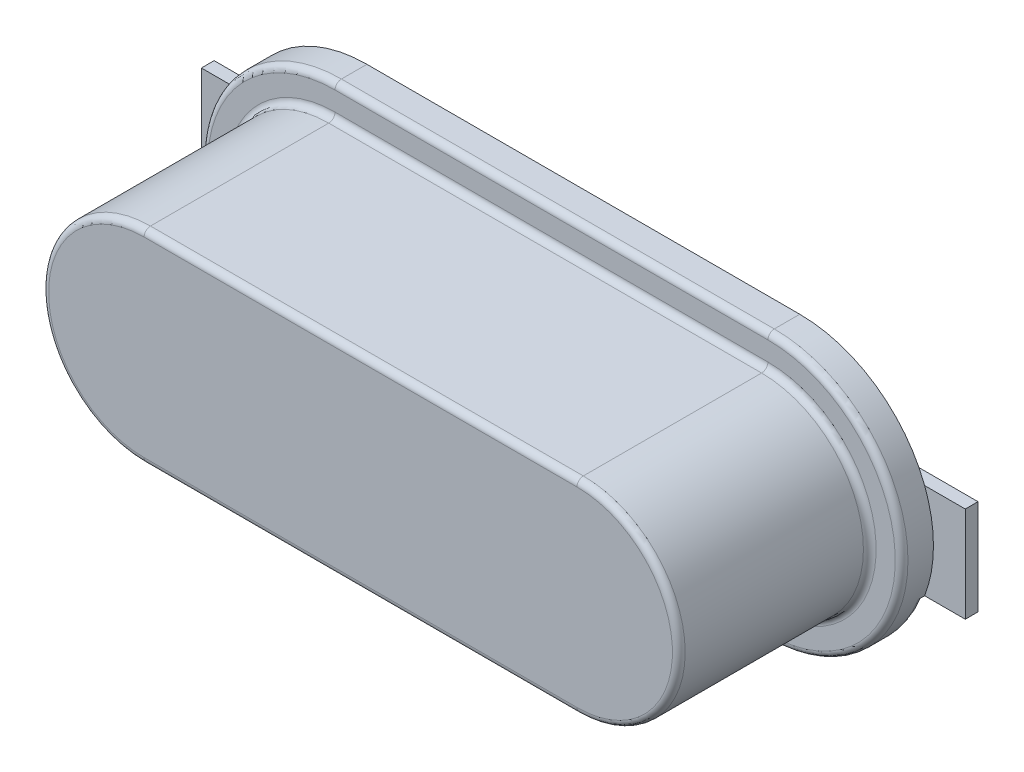
ISO-10303-21;
HEADER;
FILE_DESCRIPTION(('STEP AP214'),'2;1');
FILE_NAME('part.step','',(''),(''),'','','');
FILE_SCHEMA(('AUTOMOTIVE_DESIGN { 1 0 10303 214 1 1 1 1 }'));
ENDSEC;
DATA;
#1=APPLICATION_CONTEXT('core data for automotive mechanical design processes');
#2=APPLICATION_PROTOCOL_DEFINITION('international standard','automotive_design',2000,#1);
#3=PRODUCT_CONTEXT('',#1,'mechanical');
#4=PRODUCT('Part','Part','',(#3));
#5=PRODUCT_RELATED_PRODUCT_CATEGORY('part','',(#4));
#6=PRODUCT_DEFINITION_FORMATION('','',#4);
#7=PRODUCT_DEFINITION_CONTEXT('part definition',#1,'design');
#8=PRODUCT_DEFINITION('design','',#6,#7);
#9=PRODUCT_DEFINITION_SHAPE('','',#8);
#10=(LENGTH_UNIT() NAMED_UNIT(*) SI_UNIT(.MILLI.,.METRE.));
#11=(NAMED_UNIT(*) PLANE_ANGLE_UNIT() SI_UNIT($,.RADIAN.));
#12=(NAMED_UNIT(*) SI_UNIT($,.STERADIAN.) SOLID_ANGLE_UNIT());
#13=UNCERTAINTY_MEASURE_WITH_UNIT(LENGTH_MEASURE(1.E-05),#10,'distance_accuracy_value','');
#14=(GEOMETRIC_REPRESENTATION_CONTEXT(3) GLOBAL_UNCERTAINTY_ASSIGNED_CONTEXT((#13)) GLOBAL_UNIT_ASSIGNED_CONTEXT((#10,
#11,#12)) REPRESENTATION_CONTEXT('',''));
#15=CARTESIAN_POINT('',(0.,0.,0.));
#16=DIRECTION('',(0.,0.,1.));
#17=DIRECTION('',(1.,0.,0.));
#18=AXIS2_PLACEMENT_3D('',#15,#16,#17);
#19=CARTESIAN_POINT('',(3.4,0.,0.));
#20=DIRECTION('',(0.,0.,1.));
#21=DIRECTION('',(1.,0.,0.));
#22=AXIS2_PLACEMENT_3D('',#19,#20,#21);
#23=PLANE('',#22);
#24=DIRECTION('',(1.,0.,0.));
#25=VECTOR('',#24,1.);
#26=CARTESIAN_POINT('',(3.4,-2.,0.));
#27=LINE('',#26,#25);
#28=CARTESIAN_POINT('',(3.4,-2.,0.));
#29=VERTEX_POINT('',#28);
#30=CARTESIAN_POINT('',(-3.4,-2.,0.));
#31=VERTEX_POINT('',#30);
#32=EDGE_CURVE('E318',#29,#31,#27,.F.);
#33=ORIENTED_EDGE('',*,*,#32,.T.);
#34=CARTESIAN_POINT('',(-3.4,0.,0.));
#35=DIRECTION('',(0.,0.,1.));
#36=DIRECTION('',(1.,0.,0.));
#37=AXIS2_PLACEMENT_3D('',#34,#35,#36);
#38=CIRCLE('',#37,2.);
#39=CARTESIAN_POINT('',(-5.25404962177391,-0.75,0.));
#40=VERTEX_POINT('',#39);
#41=EDGE_CURVE('E322',#31,#40,#38,.F.);
#42=ORIENTED_EDGE('',*,*,#41,.T.);
#43=DIRECTION('',(-1.,0.,0.));
#44=VECTOR('',#43,1.);
#45=CARTESIAN_POINT('',(-6.00000000000001,-0.75,0.));
#46=LINE('',#45,#44);
#47=CARTESIAN_POINT('',(-2.5,-0.75,0.));
#48=VERTEX_POINT('',#47);
#49=EDGE_CURVE('E263',#48,#40,#46,.T.);
#50=ORIENTED_EDGE('',*,*,#49,.F.);
#51=DIRECTION('',(0.,-1.,0.));
#52=VECTOR('',#51,1.);
#53=CARTESIAN_POINT('',(-2.49999999999999,0.75,0.));
#54=LINE('',#53,#52);
#55=CARTESIAN_POINT('',(-2.49999999999999,0.75,0.));
#56=VERTEX_POINT('',#55);
#57=EDGE_CURVE('E242',#56,#48,#54,.T.);
#58=ORIENTED_EDGE('',*,*,#57,.F.);
#59=DIRECTION('',(1.,0.,0.));
#60=VECTOR('',#59,1.);
#61=CARTESIAN_POINT('',(-5.99999999999999,0.75,0.));
#62=LINE('',#61,#60);
#63=CARTESIAN_POINT('',(-5.3615045245933,0.75,0.));
#64=VERTEX_POINT('',#63);
#65=EDGE_CURVE('E244',#64,#56,#62,.T.);
#66=ORIENTED_EDGE('',*,*,#65,.F.);
#67=CARTESIAN_POINT('',(-3.4,0.,0.));
#68=DIRECTION('',(0.,0.,1.));
#69=DIRECTION('',(-1.,0.,0.));
#70=AXIS2_PLACEMENT_3D('',#67,#68,#69);
#71=CIRCLE('',#70,2.1);
#72=CARTESIAN_POINT('',(-3.4,2.1,0.));
#73=VERTEX_POINT('',#72);
#74=EDGE_CURVE('E298',#73,#64,#71,.T.);
#75=ORIENTED_EDGE('',*,*,#74,.F.);
#76=DIRECTION('',(-1.,0.,0.));
#77=VECTOR('',#76,1.);
#78=CARTESIAN_POINT('',(3.4,2.1,0.));
#79=LINE('',#78,#77);
#80=CARTESIAN_POINT('',(3.4,2.1,0.));
#81=VERTEX_POINT('',#80);
#82=EDGE_CURVE('E294',#81,#73,#79,.T.);
#83=ORIENTED_EDGE('',*,*,#82,.F.);
#84=CARTESIAN_POINT('',(3.4,0.,0.));
#85=DIRECTION('',(0.,0.,1.));
#86=DIRECTION('',(1.,0.,0.));
#87=AXIS2_PLACEMENT_3D('',#84,#85,#86);
#88=CIRCLE('',#87,2.1);
#89=CARTESIAN_POINT('',(5.3615045245933,0.75,0.));
#90=VERTEX_POINT('',#89);
#91=EDGE_CURVE('E290',#90,#81,#88,.T.);
#92=ORIENTED_EDGE('',*,*,#91,.F.);
#93=DIRECTION('',(1.,0.,0.));
#94=VECTOR('',#93,1.);
#95=CARTESIAN_POINT('',(6.,0.75,0.));
#96=LINE('',#95,#94);
#97=CARTESIAN_POINT('',(2.5,0.75,0.));
#98=VERTEX_POINT('',#97);
#99=EDGE_CURVE('E839',#98,#90,#96,.T.);
#100=ORIENTED_EDGE('',*,*,#99,.F.);
#101=DIRECTION('',(0.,1.,0.));
#102=VECTOR('',#101,1.);
#103=CARTESIAN_POINT('',(2.5,0.75,0.));
#104=LINE('',#103,#102);
#105=CARTESIAN_POINT('',(2.5,-0.75,0.));
#106=VERTEX_POINT('',#105);
#107=EDGE_CURVE('E233',#106,#98,#104,.T.);
#108=ORIENTED_EDGE('',*,*,#107,.F.);
#109=DIRECTION('',(-1.,0.,0.));
#110=VECTOR('',#109,1.);
#111=CARTESIAN_POINT('',(6.,-0.75,0.));
#112=LINE('',#111,#110);
#113=CARTESIAN_POINT('',(5.25404962177391,-0.75,0.));
#114=VERTEX_POINT('',#113);
#115=EDGE_CURVE('E844',#114,#106,#112,.T.);
#116=ORIENTED_EDGE('',*,*,#115,.F.);
#117=CARTESIAN_POINT('',(3.4,0.,0.));
#118=DIRECTION('',(0.,0.,1.));
#119=DIRECTION('',(1.,0.,0.));
#120=AXIS2_PLACEMENT_3D('',#117,#118,#119);
#121=CIRCLE('',#120,2.);
#122=EDGE_CURVE('E320',#114,#29,#121,.F.);
#123=ORIENTED_EDGE('',*,*,#122,.T.);
#124=EDGE_LOOP('',(#33,#42,#50,#58,#66,#75,#83,#92,#100,#108,#116,#123));
#125=FACE_BOUND('',#124,.T.);
#126=ADVANCED_FACE('F33',(#125),#23,.F.);
#127=CARTESIAN_POINT('',(3.4,0.,0.5));
#128=DIRECTION('',(0.,0.,1.));
#129=DIRECTION('',(1.,0.,0.));
#130=AXIS2_PLACEMENT_3D('',#127,#128,#129);
#131=PLANE('',#130);
#132=DIRECTION('',(-1.,0.,0.));
#133=VECTOR('',#132,1.);
#134=CARTESIAN_POINT('',(-3.4,2.,0.5));
#135=LINE('',#134,#133);
#136=CARTESIAN_POINT('',(3.4,2.,0.5));
#137=VERTEX_POINT('',#136);
#138=CARTESIAN_POINT('',(-3.4,2.,0.5));
#139=VERTEX_POINT('',#138);
#140=EDGE_CURVE('E344',#137,#139,#135,.T.);
#141=ORIENTED_EDGE('',*,*,#140,.T.);
#142=CARTESIAN_POINT('',(-3.4,0.,0.5));
#143=DIRECTION('',(0.,0.,1.));
#144=DIRECTION('',(1.,0.,0.));
#145=AXIS2_PLACEMENT_3D('',#142,#143,#144);
#146=CIRCLE('',#145,2.);
#147=CARTESIAN_POINT('',(-3.4,-2.,0.5));
#148=VERTEX_POINT('',#147);
#149=EDGE_CURVE('E346',#139,#148,#146,.T.);
#150=ORIENTED_EDGE('',*,*,#149,.T.);
#151=DIRECTION('',(1.,0.,0.));
#152=VECTOR('',#151,1.);
#153=CARTESIAN_POINT('',(3.4,-2.,0.5));
#154=LINE('',#153,#152);
#155=CARTESIAN_POINT('',(3.4,-2.,0.5));
#156=VERTEX_POINT('',#155);
#157=EDGE_CURVE('E340',#148,#156,#154,.T.);
#158=ORIENTED_EDGE('',*,*,#157,.T.);
#159=CARTESIAN_POINT('',(3.4,0.,0.5));
#160=DIRECTION('',(0.,0.,1.));
#161=DIRECTION('',(1.,0.,0.));
#162=AXIS2_PLACEMENT_3D('',#159,#160,#161);
#163=CIRCLE('',#162,2.);
#164=EDGE_CURVE('E342',#156,#137,#163,.T.);
#165=ORIENTED_EDGE('',*,*,#164,.T.);
#166=EDGE_LOOP('',(#141,#150,#158,#165));
#167=FACE_BOUND('',#166,.T.);
#168=DIRECTION('',(1.,0.,0.));
#169=VECTOR('',#168,1.);
#170=CARTESIAN_POINT('',(3.4,-1.7,0.5));
#171=LINE('',#170,#169);
#172=CARTESIAN_POINT('',(3.4,-1.7,0.5));
#173=VERTEX_POINT('',#172);
#174=CARTESIAN_POINT('',(-3.39999999999999,-1.7,0.5));
#175=VERTEX_POINT('',#174);
#176=EDGE_CURVE('E331',#173,#175,#171,.F.);
#177=ORIENTED_EDGE('',*,*,#176,.T.);
#178=CARTESIAN_POINT('',(-3.4,0.,0.5));
#179=DIRECTION('',(0.,0.,1.));
#180=DIRECTION('',(1.,0.,0.));
#181=AXIS2_PLACEMENT_3D('',#178,#179,#180);
#182=CIRCLE('',#181,1.7);
#183=CARTESIAN_POINT('',(-3.40000000000001,1.7,0.5));
#184=VERTEX_POINT('',#183);
#185=EDGE_CURVE('E337',#175,#184,#182,.F.);
#186=ORIENTED_EDGE('',*,*,#185,.T.);
#187=DIRECTION('',(-1.,0.,0.));
#188=VECTOR('',#187,1.);
#189=CARTESIAN_POINT('',(3.4,1.7,0.5));
#190=LINE('',#189,#188);
#191=CARTESIAN_POINT('',(3.4,1.7,0.5));
#192=VERTEX_POINT('',#191);
#193=EDGE_CURVE('E335',#184,#192,#190,.F.);
#194=ORIENTED_EDGE('',*,*,#193,.T.);
#195=CARTESIAN_POINT('',(3.4,0.,0.5));
#196=DIRECTION('',(0.,0.,1.));
#197=DIRECTION('',(1.,0.,0.));
#198=AXIS2_PLACEMENT_3D('',#195,#196,#197);
#199=CIRCLE('',#198,1.7);
#200=EDGE_CURVE('E333',#192,#173,#199,.F.);
#201=ORIENTED_EDGE('',*,*,#200,.T.);
#202=EDGE_LOOP('',(#177,#186,#194,#201));
#203=FACE_BOUND('',#202,.T.);
#204=ADVANCED_FACE('F459',(#167,#203),#131,.T.);
#205=CARTESIAN_POINT('',(3.4,0.,0.5));
#206=DIRECTION('',(0.,0.,-1.));
#207=DIRECTION('',(-1.,0.,0.));
#208=AXIS2_PLACEMENT_3D('',#205,#206,#207);
#209=CYLINDRICAL_SURFACE('',#208,2.1);
#210=DIRECTION('',(0.,0.,-1.));
#211=VECTOR('',#210,1.);
#212=CARTESIAN_POINT('',(3.4,-2.1,0.5));
#213=LINE('',#212,#211);
#214=CARTESIAN_POINT('',(3.4,-2.1,0.4));
#215=VERTEX_POINT('',#214);
#216=CARTESIAN_POINT('',(3.4,-2.1,0.1));
#217=VERTEX_POINT('',#216);
#218=EDGE_CURVE('E301',#215,#217,#213,.T.);
#219=ORIENTED_EDGE('',*,*,#218,.T.);
#220=CARTESIAN_POINT('',(3.4,0.,0.1));
#221=DIRECTION('',(0.,0.,1.));
#222=DIRECTION('',(1.,0.,0.));
#223=AXIS2_PLACEMENT_3D('',#220,#221,#222);
#224=CIRCLE('',#223,2.1);
#225=CARTESIAN_POINT('',(5.3615045245933,-0.75,0.1));
#226=VERTEX_POINT('',#225);
#227=EDGE_CURVE('E328',#217,#226,#224,.T.);
#228=ORIENTED_EDGE('',*,*,#227,.T.);
#229=DIRECTION('',(0.,0.,-1.));
#230=VECTOR('',#229,1.);
#231=CARTESIAN_POINT('',(5.3615045245933,-0.75,0.1));
#232=LINE('',#231,#230);
#233=CARTESIAN_POINT('',(5.3615045245933,-0.75,0.));
#234=VERTEX_POINT('',#233);
#235=EDGE_CURVE('E326',#226,#234,#232,.T.);
#236=ORIENTED_EDGE('',*,*,#235,.T.);
#237=EDGE_CURVE('E293',#234,#90,#88,.T.);
#238=ORIENTED_EDGE('',*,*,#237,.T.);
#239=ORIENTED_EDGE('',*,*,#91,.T.);
#240=DIRECTION('',(0.,0.,-1.));
#241=VECTOR('',#240,1.);
#242=CARTESIAN_POINT('',(3.4,2.1,0.5));
#243=LINE('',#242,#241);
#244=CARTESIAN_POINT('',(3.4,2.1,0.4));
#245=VERTEX_POINT('',#244);
#246=EDGE_CURVE('E309',#245,#81,#243,.T.);
#247=ORIENTED_EDGE('',*,*,#246,.F.);
#248=CARTESIAN_POINT('',(3.4,0.,0.4));
#249=DIRECTION('',(0.,0.,1.));
#250=DIRECTION('',(1.,0.,0.));
#251=AXIS2_PLACEMENT_3D('',#248,#249,#250);
#252=CIRCLE('',#251,2.1);
#253=EDGE_CURVE('E324',#245,#215,#252,.F.);
#254=ORIENTED_EDGE('',*,*,#253,.T.);
#255=EDGE_LOOP('',(#219,#228,#236,#238,#239,#247,#254));
#256=FACE_BOUND('',#255,.T.);
#257=ADVANCED_FACE('F403',(#256),#209,.T.);
#258=CARTESIAN_POINT('',(3.4,2.1,0.5));
#259=DIRECTION('',(0.,-1.,0.));
#260=DIRECTION('',(0.,0.,-1.));
#261=AXIS2_PLACEMENT_3D('',#258,#259,#260);
#262=PLANE('',#261);
#263=DIRECTION('',(0.,0.,-1.));
#264=VECTOR('',#263,1.);
#265=CARTESIAN_POINT('',(-3.4,2.1,0.5));
#266=LINE('',#265,#264);
#267=CARTESIAN_POINT('',(-3.4,2.1,0.4));
#268=VERTEX_POINT('',#267);
#269=EDGE_CURVE('E307',#268,#73,#266,.T.);
#270=ORIENTED_EDGE('',*,*,#269,.F.);
#271=DIRECTION('',(-1.,0.,0.));
#272=VECTOR('',#271,1.);
#273=CARTESIAN_POINT('',(3.4,2.1,0.4));
#274=LINE('',#273,#272);
#275=EDGE_CURVE('E349',#268,#245,#274,.F.);
#276=ORIENTED_EDGE('',*,*,#275,.T.);
#277=ORIENTED_EDGE('',*,*,#246,.T.);
#278=ORIENTED_EDGE('',*,*,#82,.T.);
#279=EDGE_LOOP('',(#270,#276,#277,#278));
#280=FACE_BOUND('',#279,.T.);
#281=ADVANCED_FACE('F476',(#280),#262,.F.);
#282=CARTESIAN_POINT('',(-3.4,0.,0.5));
#283=DIRECTION('',(0.,0.,-1.));
#284=DIRECTION('',(-1.,0.,0.));
#285=AXIS2_PLACEMENT_3D('',#282,#283,#284);
#286=CYLINDRICAL_SURFACE('',#285,2.1);
#287=DIRECTION('',(0.,0.,-1.));
#288=VECTOR('',#287,1.);
#289=CARTESIAN_POINT('',(-5.3615045245933,-0.75,0.));
#290=LINE('',#289,#288);
#291=CARTESIAN_POINT('',(-5.3615045245933,-0.75,0.));
#292=VERTEX_POINT('',#291);
#293=CARTESIAN_POINT('',(-5.3615045245933,-0.75,0.1));
#294=VERTEX_POINT('',#293);
#295=EDGE_CURVE('E50',#292,#294,#290,.F.);
#296=ORIENTED_EDGE('',*,*,#295,.T.);
#297=CARTESIAN_POINT('',(-3.4,0.,0.1));
#298=DIRECTION('',(0.,0.,1.));
#299=DIRECTION('',(1.,0.,0.));
#300=AXIS2_PLACEMENT_3D('',#297,#298,#299);
#301=CIRCLE('',#300,2.1);
#302=CARTESIAN_POINT('',(-3.4,-2.1,0.1));
#303=VERTEX_POINT('',#302);
#304=EDGE_CURVE('E315',#294,#303,#301,.T.);
#305=ORIENTED_EDGE('',*,*,#304,.T.);
#306=DIRECTION('',(0.,0.,-1.));
#307=VECTOR('',#306,1.);
#308=CARTESIAN_POINT('',(-3.4,-2.1,0.5));
#309=LINE('',#308,#307);
#310=CARTESIAN_POINT('',(-3.4,-2.1,0.4));
#311=VERTEX_POINT('',#310);
#312=EDGE_CURVE('E304',#311,#303,#309,.T.);
#313=ORIENTED_EDGE('',*,*,#312,.F.);
#314=CARTESIAN_POINT('',(-3.4,0.,0.4));
#315=DIRECTION('',(0.,0.,1.));
#316=DIRECTION('',(1.,0.,0.));
#317=AXIS2_PLACEMENT_3D('',#314,#315,#316);
#318=CIRCLE('',#317,2.1);
#319=EDGE_CURVE('E311',#311,#268,#318,.F.);
#320=ORIENTED_EDGE('',*,*,#319,.T.);
#321=ORIENTED_EDGE('',*,*,#269,.T.);
#322=ORIENTED_EDGE('',*,*,#74,.T.);
#323=EDGE_CURVE('E297',#64,#292,#71,.T.);
#324=ORIENTED_EDGE('',*,*,#323,.T.);
#325=EDGE_LOOP('',(#296,#305,#313,#320,#321,#322,#324));
#326=FACE_BOUND('',#325,.T.);
#327=ADVANCED_FACE('F473',(#326),#286,.T.);
#328=CARTESIAN_POINT('',(3.4,-2.1,0.5));
#329=DIRECTION('',(0.,1.,0.));
#330=DIRECTION('',(0.,0.,1.));
#331=AXIS2_PLACEMENT_3D('',#328,#329,#330);
#332=PLANE('',#331);
#333=ORIENTED_EDGE('',*,*,#312,.T.);
#334=DIRECTION('',(1.,0.,0.));
#335=VECTOR('',#334,1.);
#336=CARTESIAN_POINT('',(3.4,-2.1,0.1));
#337=LINE('',#336,#335);
#338=EDGE_CURVE('E374',#303,#217,#337,.T.);
#339=ORIENTED_EDGE('',*,*,#338,.T.);
#340=ORIENTED_EDGE('',*,*,#218,.F.);
#341=DIRECTION('',(1.,0.,0.));
#342=VECTOR('',#341,1.);
#343=CARTESIAN_POINT('',(-3.4,-2.1,0.4));
#344=LINE('',#343,#342);
#345=EDGE_CURVE('E372',#215,#311,#344,.F.);
#346=ORIENTED_EDGE('',*,*,#345,.T.);
#347=EDGE_LOOP('',(#333,#339,#340,#346));
#348=FACE_BOUND('',#347,.T.);
#349=ADVANCED_FACE('F469',(#348),#332,.F.);
#350=CARTESIAN_POINT('',(3.4,0.,3.5));
#351=DIRECTION('',(0.,0.,-1.));
#352=DIRECTION('',(-1.,0.,0.));
#353=AXIS2_PLACEMENT_3D('',#350,#351,#352);
#354=CYLINDRICAL_SURFACE('',#353,1.6);
#355=DIRECTION('',(0.,0.,-1.));
#356=VECTOR('',#355,1.);
#357=CARTESIAN_POINT('',(3.4,-1.6,3.5));
#358=LINE('',#357,#356);
#359=CARTESIAN_POINT('',(3.4,-1.6,3.4));
#360=VERTEX_POINT('',#359);
#361=CARTESIAN_POINT('',(3.4,-1.6,0.6));
#362=VERTEX_POINT('',#361);
#363=EDGE_CURVE('E278',#360,#362,#358,.T.);
#364=ORIENTED_EDGE('',*,*,#363,.T.);
#365=CARTESIAN_POINT('',(3.4,0.,0.6));
#366=DIRECTION('',(0.,0.,1.));
#367=DIRECTION('',(1.,0.,0.));
#368=AXIS2_PLACEMENT_3D('',#365,#366,#367);
#369=CIRCLE('',#368,1.6);
#370=CARTESIAN_POINT('',(3.4,1.6,0.6));
#371=VERTEX_POINT('',#370);
#372=EDGE_CURVE('E363',#362,#371,#369,.T.);
#373=ORIENTED_EDGE('',*,*,#372,.T.);
#374=DIRECTION('',(0.,0.,-1.));
#375=VECTOR('',#374,1.);
#376=CARTESIAN_POINT('',(3.4,1.6,3.5));
#377=LINE('',#376,#375);
#378=CARTESIAN_POINT('',(3.4,1.6,3.4));
#379=VERTEX_POINT('',#378);
#380=EDGE_CURVE('E287',#379,#371,#377,.T.);
#381=ORIENTED_EDGE('',*,*,#380,.F.);
#382=CARTESIAN_POINT('',(3.4,0.,3.4));
#383=DIRECTION('',(0.,0.,1.));
#384=DIRECTION('',(1.,0.,0.));
#385=AXIS2_PLACEMENT_3D('',#382,#383,#384);
#386=CIRCLE('',#385,1.6);
#387=EDGE_CURVE('E361',#379,#360,#386,.F.);
#388=ORIENTED_EDGE('',*,*,#387,.T.);
#389=EDGE_LOOP('',(#364,#373,#381,#388));
#390=FACE_BOUND('',#389,.T.);
#391=ADVANCED_FACE('F472',(#390),#354,.T.);
#392=CARTESIAN_POINT('',(-3.40000000000001,1.6,3.5));
#393=DIRECTION('',(0.,-1.,0.));
#394=DIRECTION('',(0.,0.,-1.));
#395=AXIS2_PLACEMENT_3D('',#392,#393,#394);
#396=PLANE('',#395);
#397=ORIENTED_EDGE('',*,*,#380,.T.);
#398=DIRECTION('',(-1.,0.,0.));
#399=VECTOR('',#398,1.);
#400=CARTESIAN_POINT('',(-3.40000000000001,1.6,0.6));
#401=LINE('',#400,#399);
#402=CARTESIAN_POINT('',(-3.40000000000001,1.6,0.6));
#403=VERTEX_POINT('',#402);
#404=EDGE_CURVE('E359',#371,#403,#401,.T.);
#405=ORIENTED_EDGE('',*,*,#404,.T.);
#406=DIRECTION('',(0.,0.,-1.));
#407=VECTOR('',#406,1.);
#408=CARTESIAN_POINT('',(-3.40000000000001,1.6,3.5));
#409=LINE('',#408,#407);
#410=CARTESIAN_POINT('',(-3.40000000000001,1.6,3.4));
#411=VERTEX_POINT('',#410);
#412=EDGE_CURVE('E284',#411,#403,#409,.T.);
#413=ORIENTED_EDGE('',*,*,#412,.F.);
#414=DIRECTION('',(-1.,0.,0.));
#415=VECTOR('',#414,1.);
#416=CARTESIAN_POINT('',(3.4,1.6,3.4));
#417=LINE('',#416,#415);
#418=EDGE_CURVE('E356',#411,#379,#417,.F.);
#419=ORIENTED_EDGE('',*,*,#418,.T.);
#420=EDGE_LOOP('',(#397,#405,#413,#419));
#421=FACE_BOUND('',#420,.T.);
#422=ADVANCED_FACE('F555',(#421),#396,.F.);
#423=CARTESIAN_POINT('',(-3.4,0.,3.5));
#424=DIRECTION('',(0.,0.,-1.));
#425=DIRECTION('',(-1.,0.,0.));
#426=AXIS2_PLACEMENT_3D('',#423,#424,#425);
#427=CYLINDRICAL_SURFACE('',#426,1.6);
#428=ORIENTED_EDGE('',*,*,#412,.T.);
#429=CARTESIAN_POINT('',(-3.4,0.,0.6));
#430=DIRECTION('',(0.,0.,1.));
#431=DIRECTION('',(1.,0.,0.));
#432=AXIS2_PLACEMENT_3D('',#429,#430,#431);
#433=CIRCLE('',#432,1.6);
#434=CARTESIAN_POINT('',(-3.39999999999999,-1.6,0.6));
#435=VERTEX_POINT('',#434);
#436=EDGE_CURVE('E353',#403,#435,#433,.T.);
#437=ORIENTED_EDGE('',*,*,#436,.T.);
#438=DIRECTION('',(0.,0.,-1.));
#439=VECTOR('',#438,1.);
#440=CARTESIAN_POINT('',(-3.39999999999999,-1.6,3.5));
#441=LINE('',#440,#439);
#442=CARTESIAN_POINT('',(-3.39999999999999,-1.6,3.4));
#443=VERTEX_POINT('',#442);
#444=EDGE_CURVE('E281',#443,#435,#441,.T.);
#445=ORIENTED_EDGE('',*,*,#444,.F.);
#446=CARTESIAN_POINT('',(-3.4,0.,3.4));
#447=DIRECTION('',(0.,0.,1.));
#448=DIRECTION('',(1.,0.,0.));
#449=AXIS2_PLACEMENT_3D('',#446,#447,#448);
#450=CIRCLE('',#449,1.6);
#451=EDGE_CURVE('E351',#443,#411,#450,.F.);
#452=ORIENTED_EDGE('',*,*,#451,.T.);
#453=EDGE_LOOP('',(#428,#437,#445,#452));
#454=FACE_BOUND('',#453,.T.);
#455=ADVANCED_FACE('F538',(#454),#427,.T.);
#456=CARTESIAN_POINT('',(-3.39999999999999,-1.6,3.5));
#457=DIRECTION('',(0.,1.,0.));
#458=DIRECTION('',(0.,0.,1.));
#459=AXIS2_PLACEMENT_3D('',#456,#457,#458);
#460=PLANE('',#459);
#461=ORIENTED_EDGE('',*,*,#444,.T.);
#462=DIRECTION('',(1.,0.,0.));
#463=VECTOR('',#462,1.);
#464=CARTESIAN_POINT('',(-3.39999999999999,-1.6,0.6));
#465=LINE('',#464,#463);
#466=EDGE_CURVE('E378',#435,#362,#465,.T.);
#467=ORIENTED_EDGE('',*,*,#466,.T.);
#468=ORIENTED_EDGE('',*,*,#363,.F.);
#469=DIRECTION('',(1.,0.,0.));
#470=VECTOR('',#469,1.);
#471=CARTESIAN_POINT('',(-3.39999999999999,-1.6,3.4));
#472=LINE('',#471,#470);
#473=EDGE_CURVE('E376',#360,#443,#472,.F.);
#474=ORIENTED_EDGE('',*,*,#473,.T.);
#475=EDGE_LOOP('',(#461,#467,#468,#474));
#476=FACE_BOUND('',#475,.T.);
#477=ADVANCED_FACE('F536',(#476),#460,.F.);
#478=CARTESIAN_POINT('',(3.4,0.,3.5));
#479=DIRECTION('',(0.,0.,1.));
#480=DIRECTION('',(1.,0.,0.));
#481=AXIS2_PLACEMENT_3D('',#478,#479,#480);
#482=PLANE('',#481);
#483=CARTESIAN_POINT('',(3.4,0.,3.5));
#484=DIRECTION('',(0.,0.,1.));
#485=DIRECTION('',(1.,0.,0.));
#486=AXIS2_PLACEMENT_3D('',#483,#484,#485);
#487=CIRCLE('',#486,1.5);
#488=CARTESIAN_POINT('',(3.4,-1.5,3.5));
#489=VERTEX_POINT('',#488);
#490=CARTESIAN_POINT('',(3.4,1.5,3.5));
#491=VERTEX_POINT('',#490);
#492=EDGE_CURVE('E58',#489,#491,#487,.T.);
#493=ORIENTED_EDGE('',*,*,#492,.T.);
#494=DIRECTION('',(-1.,0.,0.));
#495=VECTOR('',#494,1.);
#496=CARTESIAN_POINT('',(-3.40000000000001,1.5,3.5));
#497=LINE('',#496,#495);
#498=CARTESIAN_POINT('',(-3.40000000000001,1.5,3.5));
#499=VERTEX_POINT('',#498);
#500=EDGE_CURVE('E370',#491,#499,#497,.T.);
#501=ORIENTED_EDGE('',*,*,#500,.T.);
#502=CARTESIAN_POINT('',(-3.4,0.,3.5));
#503=DIRECTION('',(0.,0.,1.));
#504=DIRECTION('',(1.,0.,0.));
#505=AXIS2_PLACEMENT_3D('',#502,#503,#504);
#506=CIRCLE('',#505,1.5);
#507=CARTESIAN_POINT('',(-3.39999999999999,-1.5,3.5));
#508=VERTEX_POINT('',#507);
#509=EDGE_CURVE('E367',#499,#508,#506,.T.);
#510=ORIENTED_EDGE('',*,*,#509,.T.);
#511=DIRECTION('',(1.,0.,0.));
#512=VECTOR('',#511,1.);
#513=CARTESIAN_POINT('',(3.4,-1.5,3.5));
#514=LINE('',#513,#512);
#515=EDGE_CURVE('E365',#508,#489,#514,.T.);
#516=ORIENTED_EDGE('',*,*,#515,.T.);
#517=EDGE_LOOP('',(#493,#501,#510,#516));
#518=FACE_BOUND('',#517,.T.);
#519=ADVANCED_FACE('F559',(#518),#482,.T.);
#520=CARTESIAN_POINT('',(-5.99999999999999,0.75,-0.2));
#521=DIRECTION('',(0.,-1.,0.));
#522=DIRECTION('',(0.,0.,-1.));
#523=AXIS2_PLACEMENT_3D('',#520,#521,#522);
#524=PLANE('',#523);
#525=CARTESIAN_POINT('',(-5.99999999999999,0.75,0.));
#526=VERTEX_POINT('',#525);
#527=EDGE_CURVE('E239',#526,#64,#62,.T.);
#528=ORIENTED_EDGE('',*,*,#527,.T.);
#529=ORIENTED_EDGE('',*,*,#65,.T.);
#530=DIRECTION('',(0.,0.,1.));
#531=VECTOR('',#530,1.);
#532=CARTESIAN_POINT('',(-2.49999999999999,0.75,-0.2));
#533=LINE('',#532,#531);
#534=CARTESIAN_POINT('',(-2.49999999999999,0.75,-0.2));
#535=VERTEX_POINT('',#534);
#536=EDGE_CURVE('E275',#535,#56,#533,.T.);
#537=ORIENTED_EDGE('',*,*,#536,.F.);
#538=DIRECTION('',(1.,0.,0.));
#539=VECTOR('',#538,1.);
#540=CARTESIAN_POINT('',(-5.99999999999999,0.75,-0.2));
#541=LINE('',#540,#539);
#542=CARTESIAN_POINT('',(-5.99999999999999,0.75,-0.2));
#543=VERTEX_POINT('',#542);
#544=EDGE_CURVE('E249',#543,#535,#541,.T.);
#545=ORIENTED_EDGE('',*,*,#544,.F.);
#546=DIRECTION('',(0.,0.,1.));
#547=VECTOR('',#546,1.);
#548=CARTESIAN_POINT('',(-5.99999999999999,0.75,-0.2));
#549=LINE('',#548,#547);
#550=EDGE_CURVE('E258',#543,#526,#549,.T.);
#551=ORIENTED_EDGE('',*,*,#550,.T.);
#552=EDGE_LOOP('',(#528,#529,#537,#545,#551));
#553=FACE_BOUND('',#552,.T.);
#554=ADVANCED_FACE('F561',(#553),#524,.F.);
#555=CARTESIAN_POINT('',(-2.49999999999999,0.75,-0.2));
#556=DIRECTION('',(-1.,0.,0.));
#557=DIRECTION('',(0.,-1.,0.));
#558=AXIS2_PLACEMENT_3D('',#555,#556,#557);
#559=PLANE('',#558);
#560=ORIENTED_EDGE('',*,*,#57,.T.);
#561=DIRECTION('',(0.,0.,1.));
#562=VECTOR('',#561,1.);
#563=CARTESIAN_POINT('',(-2.5,-0.75,-0.2));
#564=LINE('',#563,#562);
#565=CARTESIAN_POINT('',(-2.5,-0.75,-0.2));
#566=VERTEX_POINT('',#565);
#567=EDGE_CURVE('E272',#566,#48,#564,.T.);
#568=ORIENTED_EDGE('',*,*,#567,.F.);
#569=DIRECTION('',(0.,-1.,0.));
#570=VECTOR('',#569,1.);
#571=CARTESIAN_POINT('',(-2.49999999999999,0.75,-0.2));
#572=LINE('',#571,#570);
#573=EDGE_CURVE('E252',#535,#566,#572,.T.);
#574=ORIENTED_EDGE('',*,*,#573,.F.);
#575=ORIENTED_EDGE('',*,*,#536,.T.);
#576=EDGE_LOOP('',(#560,#568,#574,#575));
#577=FACE_BOUND('',#576,.T.);
#578=ADVANCED_FACE('F567',(#577),#559,.F.);
#579=CARTESIAN_POINT('',(-6.00000000000001,-0.75,-0.2));
#580=DIRECTION('',(0.,1.,0.));
#581=DIRECTION('',(-1.,0.,0.));
#582=AXIS2_PLACEMENT_3D('',#579,#580,#581);
#583=PLANE('',#582);
#584=ORIENTED_EDGE('',*,*,#49,.T.);
#585=CARTESIAN_POINT('',(-5.25404962177391,-0.75,0.));
#586=CARTESIAN_POINT('',(-5.26045161334954,-0.75,-3.27733784088097E-06));
#587=CARTESIAN_POINT('',(-5.26685570524247,-0.75,0.000528249062431169));
#588=CARTESIAN_POINT('',(-5.27949864330804,-0.75,0.00264559579485983));
#589=CARTESIAN_POINT('',(-5.28573717218737,-0.75,0.00423330711296517));
#590=CARTESIAN_POINT('',(-5.29786393809105,-0.75,0.00845062253609257));
#591=CARTESIAN_POINT('',(-5.3037516600803,-0.75,0.0110817171347846));
#592=CARTESIAN_POINT('',(-5.31497004181967,-0.75,0.0173359783676304));
#593=CARTESIAN_POINT('',(-5.32030122458989,-0.75,0.0209582017576487));
#594=CARTESIAN_POINT('',(-5.33000322319749,-0.75,0.0289396120595413));
#595=CARTESIAN_POINT('',(-5.33440537338958,-0.75,0.033260628819546));
#596=CARTESIAN_POINT('',(-5.34235593053991,-0.75,0.0426315736421745));
#597=CARTESIAN_POINT('',(-5.34590436296105,-0.75,0.0476814799578188));
#598=CARTESIAN_POINT('',(-5.3517782795725,-0.75,0.0579810578492944));
#599=CARTESIAN_POINT('',(-5.35417210942355,-0.75,0.063191842939927));
#600=CARTESIAN_POINT('',(-5.35798633008743,-0.75,0.0739543167991529));
#601=CARTESIAN_POINT('',(-5.35940832812174,-0.75,0.0795054260845064));
#602=CARTESIAN_POINT('',(-5.36071074513873,-0.75,0.0875920159199155));
#603=CARTESIAN_POINT('',(-5.36100835082311,-0.75,0.0900661463678952));
#604=CARTESIAN_POINT('',(-5.36140505713029,-0.75,0.0950264127283379));
#605=CARTESIAN_POINT('',(-5.36150446448553,-0.75,0.0975125241116698));
#606=CARTESIAN_POINT('',(-5.36150452459331,-0.75,0.0999999999999984));
#607=B_SPLINE_CURVE_WITH_KNOTS('',3,(#585,#586,#587,#588,#589,#590,#591,#592,#593,#594,#595,
#596,#597,#598,#599,#600,#601,#602,#603,#604,#605,#606),.UNSPECIFIED.,.F.,.F.,(4,2,2,2,2,2,2,2,
2,2,4),(0.,0.0191875410913328,0.0384095282117053,0.0576590738119068,0.0768903632116757,
0.0952986860522384,0.113706459779846,0.130822477311193,0.147910119320075,0.155379429067195,
0.162837170283035),.UNSPECIFIED.);
#608=EDGE_CURVE('E42',#40,#294,#607,.T.);
#609=ORIENTED_EDGE('',*,*,#608,.T.);
#610=ORIENTED_EDGE('',*,*,#295,.F.);
#611=CARTESIAN_POINT('',(-6.00000000000001,-0.75,0.));
#612=VERTEX_POINT('',#611);
#613=EDGE_CURVE('E262',#292,#612,#46,.T.);
#614=ORIENTED_EDGE('',*,*,#613,.T.);
#615=DIRECTION('',(0.,0.,1.));
#616=VECTOR('',#615,1.);
#617=CARTESIAN_POINT('',(-6.00000000000001,-0.75,-0.2));
#618=LINE('',#617,#616);
#619=CARTESIAN_POINT('',(-6.00000000000001,-0.75,-0.2));
#620=VERTEX_POINT('',#619);
#621=EDGE_CURVE('E269',#620,#612,#618,.T.);
#622=ORIENTED_EDGE('',*,*,#621,.F.);
#623=DIRECTION('',(-1.,0.,0.));
#624=VECTOR('',#623,1.);
#625=CARTESIAN_POINT('',(-6.00000000000001,-0.75,-0.2));
#626=LINE('',#625,#624);
#627=EDGE_CURVE('E255',#566,#620,#626,.T.);
#628=ORIENTED_EDGE('',*,*,#627,.F.);
#629=ORIENTED_EDGE('',*,*,#567,.T.);
#630=EDGE_LOOP('',(#584,#609,#610,#614,#622,#628,#629));
#631=FACE_BOUND('',#630,.T.);
#632=ADVANCED_FACE('F391',(#631),#583,.F.);
#633=CARTESIAN_POINT('',(-5.99999999999999,0.75,-0.2));
#634=DIRECTION('',(1.,0.,0.));
#635=DIRECTION('',(0.,1.,0.));
#636=AXIS2_PLACEMENT_3D('',#633,#634,#635);
#637=PLANE('',#636);
#638=DIRECTION('',(0.,1.,0.));
#639=VECTOR('',#638,1.);
#640=CARTESIAN_POINT('',(-5.99999999999999,0.75,0.));
#641=LINE('',#640,#639);
#642=EDGE_CURVE('E253',#612,#526,#641,.T.);
#643=ORIENTED_EDGE('',*,*,#642,.T.);
#644=ORIENTED_EDGE('',*,*,#550,.F.);
#645=DIRECTION('',(0.,1.,0.));
#646=VECTOR('',#645,1.);
#647=CARTESIAN_POINT('',(-5.99999999999999,0.75,-0.2));
#648=LINE('',#647,#646);
#649=EDGE_CURVE('E257',#620,#543,#648,.T.);
#650=ORIENTED_EDGE('',*,*,#649,.F.);
#651=ORIENTED_EDGE('',*,*,#621,.T.);
#652=EDGE_LOOP('',(#643,#644,#650,#651));
#653=FACE_BOUND('',#652,.T.);
#654=ADVANCED_FACE('F606',(#653),#637,.F.);
#655=CARTESIAN_POINT('',(-2.49999999999999,0.75,-0.2));
#656=DIRECTION('',(0.,0.,-1.));
#657=DIRECTION('',(-1.,0.,0.));
#658=AXIS2_PLACEMENT_3D('',#655,#656,#657);
#659=PLANE('',#658);
#660=ORIENTED_EDGE('',*,*,#544,.T.);
#661=ORIENTED_EDGE('',*,*,#573,.T.);
#662=ORIENTED_EDGE('',*,*,#627,.T.);
#663=ORIENTED_EDGE('',*,*,#649,.T.);
#664=EDGE_LOOP('',(#660,#661,#662,#663));
#665=FACE_BOUND('',#664,.T.);
#666=ADVANCED_FACE('F758',(#665),#659,.T.);
#667=CARTESIAN_POINT('',(-2.49999999999999,0.75,0.));
#668=DIRECTION('',(0.,0.,-1.));
#669=DIRECTION('',(-1.,0.,0.));
#670=AXIS2_PLACEMENT_3D('',#667,#668,#669);
#671=PLANE('',#670);
#672=ORIENTED_EDGE('',*,*,#323,.F.);
#673=ORIENTED_EDGE('',*,*,#527,.F.);
#674=ORIENTED_EDGE('',*,*,#642,.F.);
#675=ORIENTED_EDGE('',*,*,#613,.F.);
#676=EDGE_LOOP('',(#672,#673,#674,#675));
#677=FACE_BOUND('',#676,.T.);
#678=ADVANCED_FACE('F748',(#677),#671,.F.);
#679=CARTESIAN_POINT('',(2.5,0.75,0.));
#680=DIRECTION('',(0.,0.,1.));
#681=DIRECTION('',(1.,0.,0.));
#682=AXIS2_PLACEMENT_3D('',#679,#680,#681);
#683=PLANE('',#682);
#684=ORIENTED_EDGE('',*,*,#237,.F.);
#685=CARTESIAN_POINT('',(6.,-0.75,0.));
#686=VERTEX_POINT('',#685);
#687=EDGE_CURVE('E843',#686,#234,#112,.T.);
#688=ORIENTED_EDGE('',*,*,#687,.F.);
#689=DIRECTION('',(0.,-1.,0.));
#690=VECTOR('',#689,1.);
#691=CARTESIAN_POINT('',(6.,0.75,0.));
#692=LINE('',#691,#690);
#693=CARTESIAN_POINT('',(6.,0.75,0.));
#694=VERTEX_POINT('',#693);
#695=EDGE_CURVE('E847',#694,#686,#692,.T.);
#696=ORIENTED_EDGE('',*,*,#695,.F.);
#697=EDGE_CURVE('E237',#90,#694,#96,.T.);
#698=ORIENTED_EDGE('',*,*,#697,.F.);
#699=EDGE_LOOP('',(#684,#688,#696,#698));
#700=FACE_BOUND('',#699,.T.);
#701=ADVANCED_FACE('F739',(#700),#683,.T.);
#702=CARTESIAN_POINT('',(6.,0.75,-0.2));
#703=DIRECTION('',(0.,-1.,0.));
#704=DIRECTION('',(0.,0.,-1.));
#705=AXIS2_PLACEMENT_3D('',#702,#703,#704);
#706=PLANE('',#705);
#707=ORIENTED_EDGE('',*,*,#99,.T.);
#708=ORIENTED_EDGE('',*,*,#697,.T.);
#709=DIRECTION('',(0.,0.,1.));
#710=VECTOR('',#709,1.);
#711=CARTESIAN_POINT('',(6.,0.75,-0.2));
#712=LINE('',#711,#710);
#713=CARTESIAN_POINT('',(6.,0.75,-0.2));
#714=VERTEX_POINT('',#713);
#715=EDGE_CURVE('E218',#714,#694,#712,.T.);
#716=ORIENTED_EDGE('',*,*,#715,.F.);
#717=DIRECTION('',(1.,0.,0.));
#718=VECTOR('',#717,1.);
#719=CARTESIAN_POINT('',(6.,0.75,-0.2));
#720=LINE('',#719,#718);
#721=CARTESIAN_POINT('',(2.5,0.75,-0.2));
#722=VERTEX_POINT('',#721);
#723=EDGE_CURVE('E224',#722,#714,#720,.T.);
#724=ORIENTED_EDGE('',*,*,#723,.F.);
#725=DIRECTION('',(0.,0.,1.));
#726=VECTOR('',#725,1.);
#727=CARTESIAN_POINT('',(2.5,0.75,-0.2));
#728=LINE('',#727,#726);
#729=EDGE_CURVE('E851',#722,#98,#728,.T.);
#730=ORIENTED_EDGE('',*,*,#729,.T.);
#731=EDGE_LOOP('',(#707,#708,#716,#724,#730));
#732=FACE_BOUND('',#731,.T.);
#733=ADVANCED_FACE('F235',(#732),#706,.F.);
#734=CARTESIAN_POINT('',(6.,0.75,-0.2));
#735=DIRECTION('',(-1.,0.,0.));
#736=DIRECTION('',(0.,0.,1.));
#737=AXIS2_PLACEMENT_3D('',#734,#735,#736);
#738=PLANE('',#737);
#739=ORIENTED_EDGE('',*,*,#695,.T.);
#740=DIRECTION('',(0.,0.,1.));
#741=VECTOR('',#740,1.);
#742=CARTESIAN_POINT('',(6.,-0.75,-0.2));
#743=LINE('',#742,#741);
#744=CARTESIAN_POINT('',(6.,-0.75,-0.2));
#745=VERTEX_POINT('',#744);
#746=EDGE_CURVE('E220',#745,#686,#743,.T.);
#747=ORIENTED_EDGE('',*,*,#746,.F.);
#748=DIRECTION('',(0.,-1.,0.));
#749=VECTOR('',#748,1.);
#750=CARTESIAN_POINT('',(6.,0.75,-0.2));
#751=LINE('',#750,#749);
#752=EDGE_CURVE('E214',#714,#745,#751,.T.);
#753=ORIENTED_EDGE('',*,*,#752,.F.);
#754=ORIENTED_EDGE('',*,*,#715,.T.);
#755=EDGE_LOOP('',(#739,#747,#753,#754));
#756=FACE_BOUND('',#755,.T.);
#757=ADVANCED_FACE('F216',(#756),#738,.F.);
#758=CARTESIAN_POINT('',(6.,-0.75,-0.2));
#759=DIRECTION('',(0.,1.,0.));
#760=DIRECTION('',(-1.,0.,0.));
#761=AXIS2_PLACEMENT_3D('',#758,#759,#760);
#762=PLANE('',#761);
#763=ORIENTED_EDGE('',*,*,#687,.T.);
#764=ORIENTED_EDGE('',*,*,#235,.F.);
#765=CARTESIAN_POINT('',(5.3615045245933,-0.75,0.1));
#766=CARTESIAN_POINT('',(5.36151071639388,-0.75,0.0946448555567063));
#767=CARTESIAN_POINT('',(5.36104441599958,-0.75,0.0892931977131945));
#768=CARTESIAN_POINT('',(5.35921502345586,-0.75,0.0787588853947196));
#769=CARTESIAN_POINT('',(5.35785421312923,-0.75,0.0735758360260201));
#770=CARTESIAN_POINT('',(5.35428380291029,-0.75,0.0635127507367943));
#771=CARTESIAN_POINT('',(5.35207432151736,-0.75,0.0586326726230468));
#772=CARTESIAN_POINT('',(5.34688815829269,-0.75,0.0492985497457282));
#773=CARTESIAN_POINT('',(5.34391123035533,-0.75,0.0448446422764251));
#774=CARTESIAN_POINT('',(5.33720096146439,-0.75,0.0363554748966178));
#775=CARTESIAN_POINT('',(5.33344966727177,-0.75,0.0323344356362467));
#776=CARTESIAN_POINT('',(5.32536094399782,-0.75,0.0249340555355542));
#777=CARTESIAN_POINT('',(5.3210233808999,-0.75,0.0215548618422998));
#778=CARTESIAN_POINT('',(5.31159771103368,-0.75,0.0153081564844588));
#779=CARTESIAN_POINT('',(5.30647961150343,-0.75,0.0124859481081745));
#780=CARTESIAN_POINT('',(5.29586274900034,-0.75,0.00767936812505797));
#781=CARTESIAN_POINT('',(5.29036382775782,-0.75,0.00569534733113433));
#782=CARTESIAN_POINT('',(5.27975083527572,-0.75,0.00276453930023946));
#783=CARTESIAN_POINT('',(5.27466139367454,-0.75,0.00172735423386973));
#784=CARTESIAN_POINT('',(5.26439772400045,-0.75,0.000345091982090059));
#785=CARTESIAN_POINT('',(5.25922364834869,-0.75,-1.11531732300002E-06));
#786=CARTESIAN_POINT('',(5.25404962177391,-0.75,0.));
#787=B_SPLINE_CURVE_WITH_KNOTS('',3,(#765,#766,#767,#768,#769,#770,#771,#772,#773,#774,#775,
#776,#777,#778,#779,#780,#781,#782,#783,#784,#785,#786),.UNSPECIFIED.,.F.,.F.,(4,2,2,2,2,2,2,2,
2,2,4),(0.,0.0160397865820941,0.0320388149213041,0.0480356101382465,0.0640375416204024,
0.0804634933265549,0.0968932062505065,0.114351941941408,0.131817977545532,0.147353756260376,
0.162864104872081),.UNSPECIFIED.);
#788=EDGE_CURVE('E11',#226,#114,#787,.T.);
#789=ORIENTED_EDGE('',*,*,#788,.T.);
#790=ORIENTED_EDGE('',*,*,#115,.T.);
#791=DIRECTION('',(0.,0.,1.));
#792=VECTOR('',#791,1.);
#793=CARTESIAN_POINT('',(2.5,-0.75,-0.2));
#794=LINE('',#793,#792);
#795=CARTESIAN_POINT('',(2.5,-0.75,-0.2));
#796=VERTEX_POINT('',#795);
#797=EDGE_CURVE('E245',#796,#106,#794,.T.);
#798=ORIENTED_EDGE('',*,*,#797,.F.);
#799=DIRECTION('',(-1.,0.,0.));
#800=VECTOR('',#799,1.);
#801=CARTESIAN_POINT('',(6.,-0.75,-0.2));
#802=LINE('',#801,#800);
#803=EDGE_CURVE('E223',#745,#796,#802,.T.);
#804=ORIENTED_EDGE('',*,*,#803,.F.);
#805=ORIENTED_EDGE('',*,*,#746,.T.);
#806=EDGE_LOOP('',(#763,#764,#789,#790,#798,#804,#805));
#807=FACE_BOUND('',#806,.T.);
#808=ADVANCED_FACE('F614',(#807),#762,.F.);
#809=CARTESIAN_POINT('',(2.5,0.75,-0.2));
#810=DIRECTION('',(1.,0.,0.));
#811=DIRECTION('',(0.,1.,0.));
#812=AXIS2_PLACEMENT_3D('',#809,#810,#811);
#813=PLANE('',#812);
#814=ORIENTED_EDGE('',*,*,#107,.T.);
#815=ORIENTED_EDGE('',*,*,#729,.F.);
#816=DIRECTION('',(0.,1.,0.));
#817=VECTOR('',#816,1.);
#818=CARTESIAN_POINT('',(2.5,0.75,-0.2));
#819=LINE('',#818,#817);
#820=EDGE_CURVE('E229',#796,#722,#819,.T.);
#821=ORIENTED_EDGE('',*,*,#820,.F.);
#822=ORIENTED_EDGE('',*,*,#797,.T.);
#823=EDGE_LOOP('',(#814,#815,#821,#822));
#824=FACE_BOUND('',#823,.T.);
#825=ADVANCED_FACE('F619',(#824),#813,.F.);
#826=CARTESIAN_POINT('',(2.5,0.75,-0.2));
#827=DIRECTION('',(0.,0.,1.));
#828=DIRECTION('',(1.,0.,0.));
#829=AXIS2_PLACEMENT_3D('',#826,#827,#828);
#830=PLANE('',#829);
#831=ORIENTED_EDGE('',*,*,#723,.T.);
#832=ORIENTED_EDGE('',*,*,#752,.T.);
#833=ORIENTED_EDGE('',*,*,#803,.T.);
#834=ORIENTED_EDGE('',*,*,#820,.T.);
#835=EDGE_LOOP('',(#831,#832,#833,#834));
#836=FACE_BOUND('',#835,.T.);
#837=ADVANCED_FACE('F227',(#836),#830,.F.);
#838=CARTESIAN_POINT('',(3.4,0.,0.1));
#839=DIRECTION('',(0.,0.,1.));
#840=DIRECTION('',(1.,0.,0.));
#841=AXIS2_PLACEMENT_3D('',#838,#839,#840);
#842=TOROIDAL_SURFACE('',#841,2.,0.1);
#843=ORIENTED_EDGE('',*,*,#788,.F.);
#844=ORIENTED_EDGE('',*,*,#227,.F.);
#845=CARTESIAN_POINT('',(3.4,-2.,0.1));
#846=DIRECTION('',(-1.,0.,0.));
#847=DIRECTION('',(0.,0.,1.));
#848=AXIS2_PLACEMENT_3D('',#845,#846,#847);
#849=CIRCLE('',#848,0.1);
#850=EDGE_CURVE('E508',#29,#217,#849,.T.);
#851=ORIENTED_EDGE('',*,*,#850,.F.);
#852=ORIENTED_EDGE('',*,*,#122,.F.);
#853=EDGE_LOOP('',(#843,#844,#851,#852));
#854=FACE_BOUND('',#853,.T.);
#855=ADVANCED_FACE('F406',(#854),#842,.T.);
#856=CARTESIAN_POINT('',(3.4,-2.,0.1));
#857=DIRECTION('',(1.,0.,0.));
#858=DIRECTION('',(0.,0.,-1.));
#859=AXIS2_PLACEMENT_3D('',#856,#857,#858);
#860=CYLINDRICAL_SURFACE('',#859,0.1);
#861=ORIENTED_EDGE('',*,*,#850,.T.);
#862=ORIENTED_EDGE('',*,*,#338,.F.);
#863=CARTESIAN_POINT('',(-3.4,-2.,0.1));
#864=DIRECTION('',(-1.,0.,0.));
#865=DIRECTION('',(0.,0.,1.));
#866=AXIS2_PLACEMENT_3D('',#863,#864,#865);
#867=CIRCLE('',#866,0.1);
#868=EDGE_CURVE('E514',#31,#303,#867,.T.);
#869=ORIENTED_EDGE('',*,*,#868,.F.);
#870=ORIENTED_EDGE('',*,*,#32,.F.);
#871=EDGE_LOOP('',(#861,#862,#869,#870));
#872=FACE_BOUND('',#871,.T.);
#873=ADVANCED_FACE('F401',(#872),#860,.T.);
#874=CARTESIAN_POINT('',(-3.4,0.,0.1));
#875=DIRECTION('',(0.,0.,1.));
#876=DIRECTION('',(1.,0.,0.));
#877=AXIS2_PLACEMENT_3D('',#874,#875,#876);
#878=TOROIDAL_SURFACE('',#877,2.,0.1);
#879=ORIENTED_EDGE('',*,*,#608,.F.);
#880=ORIENTED_EDGE('',*,*,#41,.F.);
#881=ORIENTED_EDGE('',*,*,#868,.T.);
#882=ORIENTED_EDGE('',*,*,#304,.F.);
#883=EDGE_LOOP('',(#879,#880,#881,#882));
#884=FACE_BOUND('',#883,.T.);
#885=ADVANCED_FACE('F395',(#884),#878,.T.);
#886=CARTESIAN_POINT('',(3.4,0.,0.4));
#887=DIRECTION('',(0.,0.,1.));
#888=DIRECTION('',(1.,0.,0.));
#889=AXIS2_PLACEMENT_3D('',#886,#887,#888);
#890=TOROIDAL_SURFACE('',#889,2.,0.1);
#891=CARTESIAN_POINT('',(3.4,-2.,0.4));
#892=DIRECTION('',(-1.,0.,0.));
#893=DIRECTION('',(0.,0.,1.));
#894=AXIS2_PLACEMENT_3D('',#891,#892,#893);
#895=CIRCLE('',#894,0.1);
#896=EDGE_CURVE('E502',#215,#156,#895,.T.);
#897=ORIENTED_EDGE('',*,*,#896,.F.);
#898=ORIENTED_EDGE('',*,*,#253,.F.);
#899=CARTESIAN_POINT('',(3.4,2.,0.4));
#900=DIRECTION('',(-1.,0.,0.));
#901=DIRECTION('',(0.,0.,1.));
#902=AXIS2_PLACEMENT_3D('',#899,#900,#901);
#903=CIRCLE('',#902,0.1);
#904=EDGE_CURVE('E511',#137,#245,#903,.T.);
#905=ORIENTED_EDGE('',*,*,#904,.F.);
#906=ORIENTED_EDGE('',*,*,#164,.F.);
#907=EDGE_LOOP('',(#897,#898,#905,#906));
#908=FACE_BOUND('',#907,.T.);
#909=ADVANCED_FACE('F400',(#908),#890,.T.);
#910=CARTESIAN_POINT('',(3.4,2.,0.4));
#911=DIRECTION('',(1.,0.,0.));
#912=DIRECTION('',(0.,0.,-1.));
#913=AXIS2_PLACEMENT_3D('',#910,#911,#912);
#914=CYLINDRICAL_SURFACE('',#913,0.1);
#915=ORIENTED_EDGE('',*,*,#904,.T.);
#916=ORIENTED_EDGE('',*,*,#275,.F.);
#917=CARTESIAN_POINT('',(-3.4,2.,0.4));
#918=DIRECTION('',(-1.,0.,0.));
#919=DIRECTION('',(0.,0.,1.));
#920=AXIS2_PLACEMENT_3D('',#917,#918,#919);
#921=CIRCLE('',#920,0.1);
#922=EDGE_CURVE('E497',#139,#268,#921,.T.);
#923=ORIENTED_EDGE('',*,*,#922,.F.);
#924=ORIENTED_EDGE('',*,*,#140,.F.);
#925=EDGE_LOOP('',(#915,#916,#923,#924));
#926=FACE_BOUND('',#925,.T.);
#927=ADVANCED_FACE('F420',(#926),#914,.T.);
#928=CARTESIAN_POINT('',(3.4,-2.,0.4));
#929=DIRECTION('',(-1.,0.,0.));
#930=DIRECTION('',(0.,0.,1.));
#931=AXIS2_PLACEMENT_3D('',#928,#929,#930);
#932=CYLINDRICAL_SURFACE('',#931,0.1);
#933=ORIENTED_EDGE('',*,*,#896,.T.);
#934=ORIENTED_EDGE('',*,*,#157,.F.);
#935=CARTESIAN_POINT('',(-3.4,-2.,0.4));
#936=DIRECTION('',(-1.,0.,0.));
#937=DIRECTION('',(0.,0.,1.));
#938=AXIS2_PLACEMENT_3D('',#935,#936,#937);
#939=CIRCLE('',#938,0.1);
#940=EDGE_CURVE('E494',#311,#148,#939,.T.);
#941=ORIENTED_EDGE('',*,*,#940,.F.);
#942=ORIENTED_EDGE('',*,*,#345,.F.);
#943=EDGE_LOOP('',(#933,#934,#941,#942));
#944=FACE_BOUND('',#943,.T.);
#945=ADVANCED_FACE('F416',(#944),#932,.T.);
#946=CARTESIAN_POINT('',(-3.4,0.,0.4));
#947=DIRECTION('',(0.,0.,1.));
#948=DIRECTION('',(1.,0.,0.));
#949=AXIS2_PLACEMENT_3D('',#946,#947,#948);
#950=TOROIDAL_SURFACE('',#949,2.,0.1);
#951=ORIENTED_EDGE('',*,*,#922,.T.);
#952=ORIENTED_EDGE('',*,*,#319,.F.);
#953=ORIENTED_EDGE('',*,*,#940,.T.);
#954=ORIENTED_EDGE('',*,*,#149,.F.);
#955=EDGE_LOOP('',(#951,#952,#953,#954));
#956=FACE_BOUND('',#955,.T.);
#957=ADVANCED_FACE('F412',(#956),#950,.T.);
#958=CARTESIAN_POINT('',(3.4,0.,0.6));
#959=DIRECTION('',(0.,0.,1.));
#960=DIRECTION('',(1.,0.,0.));
#961=AXIS2_PLACEMENT_3D('',#958,#959,#960);
#962=TOROIDAL_SURFACE('',#961,1.7,0.1);
#963=CARTESIAN_POINT('',(3.4,-1.7,0.6));
#964=DIRECTION('',(1.,0.,0.));
#965=DIRECTION('',(0.,0.,-1.));
#966=AXIS2_PLACEMENT_3D('',#963,#964,#965);
#967=CIRCLE('',#966,0.1);
#968=EDGE_CURVE('E505',#173,#362,#967,.T.);
#969=ORIENTED_EDGE('',*,*,#968,.F.);
#970=ORIENTED_EDGE('',*,*,#200,.F.);
#971=CARTESIAN_POINT('',(3.4,1.7,0.6));
#972=DIRECTION('',(1.,0.,0.));
#973=DIRECTION('',(0.,0.,-1.));
#974=AXIS2_PLACEMENT_3D('',#971,#972,#973);
#975=CIRCLE('',#974,0.1);
#976=EDGE_CURVE('E500',#371,#192,#975,.T.);
#977=ORIENTED_EDGE('',*,*,#976,.F.);
#978=ORIENTED_EDGE('',*,*,#372,.F.);
#979=EDGE_LOOP('',(#969,#970,#977,#978));
#980=FACE_BOUND('',#979,.T.);
#981=ADVANCED_FACE('F415',(#980),#962,.F.);
#982=CARTESIAN_POINT('',(-3.40000000000001,1.7,0.6));
#983=DIRECTION('',(-1.,0.,0.));
#984=DIRECTION('',(0.,0.,1.));
#985=AXIS2_PLACEMENT_3D('',#982,#983,#984);
#986=CYLINDRICAL_SURFACE('',#985,0.1);
#987=ORIENTED_EDGE('',*,*,#976,.T.);
#988=ORIENTED_EDGE('',*,*,#193,.F.);
#989=CARTESIAN_POINT('',(-3.40000000000001,1.7,0.6));
#990=DIRECTION('',(1.,0.,0.));
#991=DIRECTION('',(0.,0.,-1.));
#992=AXIS2_PLACEMENT_3D('',#989,#990,#991);
#993=CIRCLE('',#992,0.1);
#994=EDGE_CURVE('E517',#403,#184,#993,.T.);
#995=ORIENTED_EDGE('',*,*,#994,.F.);
#996=ORIENTED_EDGE('',*,*,#404,.F.);
#997=EDGE_LOOP('',(#987,#988,#995,#996));
#998=FACE_BOUND('',#997,.T.);
#999=ADVANCED_FACE('F435',(#998),#986,.F.);
#1000=CARTESIAN_POINT('',(-3.39999999999999,-1.7,0.6));
#1001=DIRECTION('',(1.,0.,0.));
#1002=DIRECTION('',(0.,0.,-1.));
#1003=AXIS2_PLACEMENT_3D('',#1000,#1001,#1002);
#1004=CYLINDRICAL_SURFACE('',#1003,0.1);
#1005=ORIENTED_EDGE('',*,*,#968,.T.);
#1006=ORIENTED_EDGE('',*,*,#466,.F.);
#1007=CARTESIAN_POINT('',(-3.39999999999999,-1.7,0.6));
#1008=DIRECTION('',(1.,0.,0.));
#1009=DIRECTION('',(0.,1.,0.));
#1010=AXIS2_PLACEMENT_3D('',#1007,#1008,#1009);
#1011=CIRCLE('',#1010,0.1);
#1012=EDGE_CURVE('E515',#175,#435,#1011,.T.);
#1013=ORIENTED_EDGE('',*,*,#1012,.F.);
#1014=ORIENTED_EDGE('',*,*,#176,.F.);
#1015=EDGE_LOOP('',(#1005,#1006,#1013,#1014));
#1016=FACE_BOUND('',#1015,.T.);
#1017=ADVANCED_FACE('F431',(#1016),#1004,.F.);
#1018=CARTESIAN_POINT('',(-3.4,0.,0.6));
#1019=DIRECTION('',(0.,0.,1.));
#1020=DIRECTION('',(1.,0.,0.));
#1021=AXIS2_PLACEMENT_3D('',#1018,#1019,#1020);
#1022=TOROIDAL_SURFACE('',#1021,1.7,0.1);
#1023=ORIENTED_EDGE('',*,*,#994,.T.);
#1024=ORIENTED_EDGE('',*,*,#185,.F.);
#1025=ORIENTED_EDGE('',*,*,#1012,.T.);
#1026=ORIENTED_EDGE('',*,*,#436,.F.);
#1027=EDGE_LOOP('',(#1023,#1024,#1025,#1026));
#1028=FACE_BOUND('',#1027,.T.);
#1029=ADVANCED_FACE('F428',(#1028),#1022,.F.);
#1030=CARTESIAN_POINT('',(3.4,-1.5,3.4));
#1031=DIRECTION('',(-1.,0.,0.));
#1032=DIRECTION('',(0.,0.,1.));
#1033=AXIS2_PLACEMENT_3D('',#1030,#1031,#1032);
#1034=CYLINDRICAL_SURFACE('',#1033,0.1);
#1035=CARTESIAN_POINT('',(-3.39999999999999,-1.5,3.4));
#1036=DIRECTION('',(-1.,0.,0.));
#1037=DIRECTION('',(0.,0.,1.));
#1038=AXIS2_PLACEMENT_3D('',#1035,#1036,#1037);
#1039=CIRCLE('',#1038,0.1);
#1040=EDGE_CURVE('E524',#443,#508,#1039,.T.);
#1041=ORIENTED_EDGE('',*,*,#1040,.F.);
#1042=ORIENTED_EDGE('',*,*,#473,.F.);
#1043=CARTESIAN_POINT('',(3.4,-1.5,3.4));
#1044=DIRECTION('',(1.,0.,0.));
#1045=DIRECTION('',(0.,0.,-1.));
#1046=AXIS2_PLACEMENT_3D('',#1043,#1044,#1045);
#1047=CIRCLE('',#1046,0.1);
#1048=EDGE_CURVE('E37',#489,#360,#1047,.T.);
#1049=ORIENTED_EDGE('',*,*,#1048,.F.);
#1050=ORIENTED_EDGE('',*,*,#515,.F.);
#1051=EDGE_LOOP('',(#1041,#1042,#1049,#1050));
#1052=FACE_BOUND('',#1051,.T.);
#1053=ADVANCED_FACE('F35',(#1052),#1034,.T.);
#1054=CARTESIAN_POINT('',(3.4,0.,3.4));
#1055=DIRECTION('',(0.,0.,1.));
#1056=DIRECTION('',(1.,0.,0.));
#1057=AXIS2_PLACEMENT_3D('',#1054,#1055,#1056);
#1058=TOROIDAL_SURFACE('',#1057,1.5,0.1);
#1059=ORIENTED_EDGE('',*,*,#1048,.T.);
#1060=ORIENTED_EDGE('',*,*,#387,.F.);
#1061=CARTESIAN_POINT('',(3.4,1.5,3.4));
#1062=DIRECTION('',(-1.,0.,0.));
#1063=DIRECTION('',(0.,0.,1.));
#1064=AXIS2_PLACEMENT_3D('',#1061,#1062,#1063);
#1065=CIRCLE('',#1064,0.1);
#1066=EDGE_CURVE('E523',#491,#379,#1065,.T.);
#1067=ORIENTED_EDGE('',*,*,#1066,.F.);
#1068=ORIENTED_EDGE('',*,*,#492,.F.);
#1069=EDGE_LOOP('',(#1059,#1060,#1067,#1068));
#1070=FACE_BOUND('',#1069,.T.);
#1071=ADVANCED_FACE('F449',(#1070),#1058,.T.);
#1072=CARTESIAN_POINT('',(-3.4,0.,3.4));
#1073=DIRECTION('',(0.,0.,1.));
#1074=DIRECTION('',(1.,0.,0.));
#1075=AXIS2_PLACEMENT_3D('',#1072,#1073,#1074);
#1076=TOROIDAL_SURFACE('',#1075,1.5,0.1);
#1077=ORIENTED_EDGE('',*,*,#1040,.T.);
#1078=ORIENTED_EDGE('',*,*,#509,.F.);
#1079=CARTESIAN_POINT('',(-3.40000000000001,1.5,3.4));
#1080=DIRECTION('',(1.,0.,0.));
#1081=DIRECTION('',(0.,0.,-1.));
#1082=AXIS2_PLACEMENT_3D('',#1079,#1080,#1081);
#1083=CIRCLE('',#1082,0.1);
#1084=EDGE_CURVE('E521',#411,#499,#1083,.T.);
#1085=ORIENTED_EDGE('',*,*,#1084,.F.);
#1086=ORIENTED_EDGE('',*,*,#451,.F.);
#1087=EDGE_LOOP('',(#1077,#1078,#1085,#1086));
#1088=FACE_BOUND('',#1087,.T.);
#1089=ADVANCED_FACE('F446',(#1088),#1076,.T.);
#1090=CARTESIAN_POINT('',(3.4,1.5,3.4));
#1091=DIRECTION('',(1.,0.,0.));
#1092=DIRECTION('',(0.,0.,-1.));
#1093=AXIS2_PLACEMENT_3D('',#1090,#1091,#1092);
#1094=CYLINDRICAL_SURFACE('',#1093,0.1);
#1095=ORIENTED_EDGE('',*,*,#1066,.T.);
#1096=ORIENTED_EDGE('',*,*,#418,.F.);
#1097=ORIENTED_EDGE('',*,*,#1084,.T.);
#1098=ORIENTED_EDGE('',*,*,#500,.F.);
#1099=EDGE_LOOP('',(#1095,#1096,#1097,#1098));
#1100=FACE_BOUND('',#1099,.T.);
#1101=ADVANCED_FACE('F443',(#1100),#1094,.T.);
#1102=CLOSED_SHELL('',(#126,#204,#257,#281,#327,#349,#391,#422,#455,#477,#519,#554,#578,#632,
#654,#666,#678,#701,#733,#757,#808,#825,#837,#855,#873,#885,#909,#927,#945,#957,#981,#999,#1017,
#1029,#1053,#1071,#1089,#1101));
#1103=MANIFOLD_SOLID_BREP('B2',#1102);
#1104=ADVANCED_BREP_SHAPE_REPRESENTATION('',(#18,#1103),#14);
#1105=SHAPE_DEFINITION_REPRESENTATION(#9,#1104);
ENDSEC;
END-ISO-10303-21;
